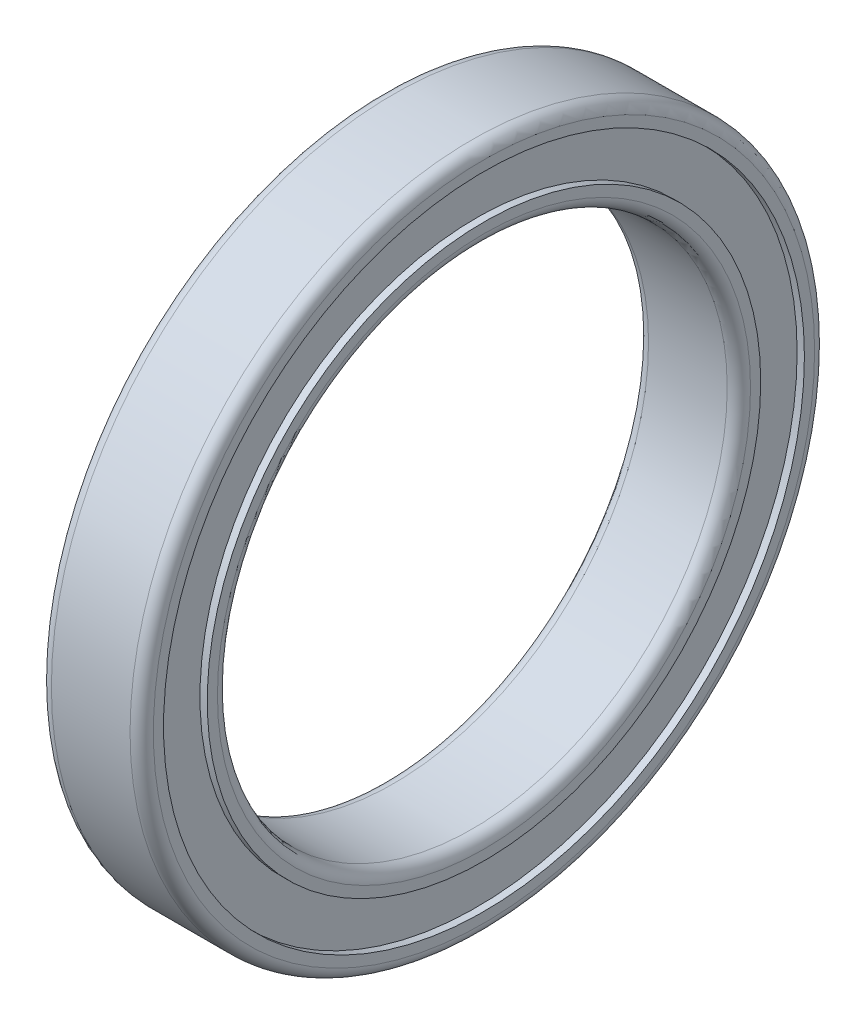
ISO-10303-21;
HEADER;
FILE_DESCRIPTION(('STEP AP214'),'2;1');
FILE_NAME('part.step','',(''),(''),'','','');
FILE_SCHEMA(('AUTOMOTIVE_DESIGN { 1 0 10303 214 1 1 1 1 }'));
ENDSEC;
DATA;
#1=APPLICATION_CONTEXT('core data for automotive mechanical design processes');
#2=APPLICATION_PROTOCOL_DEFINITION('international standard','automotive_design',2000,#1);
#3=PRODUCT_CONTEXT('',#1,'mechanical');
#4=PRODUCT('Part','Part','',(#3));
#5=PRODUCT_RELATED_PRODUCT_CATEGORY('part','',(#4));
#6=PRODUCT_DEFINITION_FORMATION('','',#4);
#7=PRODUCT_DEFINITION_CONTEXT('part definition',#1,'design');
#8=PRODUCT_DEFINITION('design','',#6,#7);
#9=PRODUCT_DEFINITION_SHAPE('','',#8);
#10=(LENGTH_UNIT() NAMED_UNIT(*) SI_UNIT(.MILLI.,.METRE.));
#11=(NAMED_UNIT(*) PLANE_ANGLE_UNIT() SI_UNIT($,.RADIAN.));
#12=(NAMED_UNIT(*) SI_UNIT($,.STERADIAN.) SOLID_ANGLE_UNIT());
#13=UNCERTAINTY_MEASURE_WITH_UNIT(LENGTH_MEASURE(1.E-05),#10,'distance_accuracy_value','');
#14=(GEOMETRIC_REPRESENTATION_CONTEXT(3) GLOBAL_UNCERTAINTY_ASSIGNED_CONTEXT((#13)) GLOBAL_UNIT_ASSIGNED_CONTEXT((#10,
#11,#12)) REPRESENTATION_CONTEXT('',''));
#15=CARTESIAN_POINT('',(0.,0.,0.));
#16=DIRECTION('',(0.,0.,1.));
#17=DIRECTION('',(1.,0.,0.));
#18=AXIS2_PLACEMENT_3D('',#15,#16,#17);
#19=CARTESIAN_POINT('',(-3.5,17.5,0.));
#20=DIRECTION('',(-1.,0.,0.));
#21=DIRECTION('',(0.,0.,1.));
#22=AXIS2_PLACEMENT_3D('',#19,#20,#21);
#23=PLANE('',#22);
#24=CARTESIAN_POINT('',(-3.5,0.,0.));
#25=DIRECTION('',(-1.,0.,0.));
#26=DIRECTION('',(0.,0.,1.));
#27=AXIS2_PLACEMENT_3D('',#24,#25,#26);
#28=CIRCLE('',#27,18.3);
#29=CARTESIAN_POINT('',(-3.5,0.,18.3));
#30=VERTEX_POINT('',#29);
#31=EDGE_CURVE('E49',#30,#30,#28,.F.);
#32=ORIENTED_EDGE('',*,*,#31,.T.);
#33=EDGE_LOOP('',(#32));
#34=FACE_BOUND('',#33,.T.);
#35=CARTESIAN_POINT('',(-3.5,0.,0.));
#36=DIRECTION('',(1.,0.,0.));
#37=DIRECTION('',(0.,0.,-1.));
#38=AXIS2_PLACEMENT_3D('',#35,#36,#37);
#39=CIRCLE('',#38,19.);
#40=CARTESIAN_POINT('',(-3.5,0.,-19.));
#41=VERTEX_POINT('',#40);
#42=EDGE_CURVE('E87',#41,#41,#39,.T.);
#43=ORIENTED_EDGE('',*,*,#42,.F.);
#44=EDGE_LOOP('',(#43));
#45=FACE_BOUND('',#44,.T.);
#46=ADVANCED_FACE('F34',(#34,#45),#23,.T.);
#47=CARTESIAN_POINT('',(0.,0.,0.));
#48=DIRECTION('',(1.,0.,0.));
#49=DIRECTION('',(0.,0.,-1.));
#50=AXIS2_PLACEMENT_3D('',#47,#48,#49);
#51=CYLINDRICAL_SURFACE('',#50,17.5);
#52=CARTESIAN_POINT('',(-2.7,0.,0.));
#53=DIRECTION('',(-1.,0.,0.));
#54=DIRECTION('',(0.,0.,1.));
#55=AXIS2_PLACEMENT_3D('',#52,#53,#54);
#56=CIRCLE('',#55,17.5);
#57=CARTESIAN_POINT('',(-2.7,0.,17.5));
#58=VERTEX_POINT('',#57);
#59=EDGE_CURVE('E41',#58,#58,#56,.T.);
#60=ORIENTED_EDGE('',*,*,#59,.T.);
#61=EDGE_LOOP('',(#60));
#62=FACE_BOUND('',#61,.T.);
#63=CARTESIAN_POINT('',(2.7,0.,0.));
#64=DIRECTION('',(1.,0.,0.));
#65=DIRECTION('',(0.,0.,-1.));
#66=AXIS2_PLACEMENT_3D('',#63,#64,#65);
#67=CIRCLE('',#66,17.5);
#68=CARTESIAN_POINT('',(2.7,0.,-17.5));
#69=VERTEX_POINT('',#68);
#70=EDGE_CURVE('E45',#69,#69,#67,.T.);
#71=ORIENTED_EDGE('',*,*,#70,.T.);
#72=EDGE_LOOP('',(#71));
#73=FACE_BOUND('',#72,.T.);
#74=ADVANCED_FACE('F95',(#62,#73),#51,.F.);
#75=CARTESIAN_POINT('',(3.5,17.5,0.));
#76=DIRECTION('',(1.,0.,0.));
#77=DIRECTION('',(0.,0.,-1.));
#78=AXIS2_PLACEMENT_3D('',#75,#76,#77);
#79=PLANE('',#78);
#80=CARTESIAN_POINT('',(3.5,0.,0.));
#81=DIRECTION('',(1.,0.,0.));
#82=DIRECTION('',(0.,0.,-1.));
#83=AXIS2_PLACEMENT_3D('',#80,#81,#82);
#84=CIRCLE('',#83,18.3);
#85=CARTESIAN_POINT('',(3.5,0.,-18.3));
#86=VERTEX_POINT('',#85);
#87=EDGE_CURVE('E10',#86,#86,#84,.F.);
#88=ORIENTED_EDGE('',*,*,#87,.T.);
#89=EDGE_LOOP('',(#88));
#90=FACE_BOUND('',#89,.T.);
#91=CARTESIAN_POINT('',(3.5,0.,0.));
#92=DIRECTION('',(1.,0.,0.));
#93=DIRECTION('',(0.,0.,-1.));
#94=AXIS2_PLACEMENT_3D('',#91,#92,#93);
#95=CIRCLE('',#94,19.);
#96=CARTESIAN_POINT('',(3.5,0.,-19.));
#97=VERTEX_POINT('',#96);
#98=EDGE_CURVE('E66',#97,#97,#95,.T.);
#99=ORIENTED_EDGE('',*,*,#98,.T.);
#100=EDGE_LOOP('',(#99));
#101=FACE_BOUND('',#100,.T.);
#102=ADVANCED_FACE('F101',(#90,#101),#79,.T.);
#103=CARTESIAN_POINT('',(0.,0.,0.));
#104=DIRECTION('',(1.,0.,0.));
#105=DIRECTION('',(0.,0.,-1.));
#106=AXIS2_PLACEMENT_3D('',#103,#104,#105);
#107=CYLINDRICAL_SURFACE('',#106,19.);
#108=CARTESIAN_POINT('',(3.,0.,0.));
#109=DIRECTION('',(1.,0.,0.));
#110=DIRECTION('',(0.,0.,-1.));
#111=AXIS2_PLACEMENT_3D('',#108,#109,#110);
#112=CIRCLE('',#111,19.);
#113=CARTESIAN_POINT('',(3.,0.,-19.));
#114=VERTEX_POINT('',#113);
#115=EDGE_CURVE('E69',#114,#114,#112,.T.);
#116=ORIENTED_EDGE('',*,*,#115,.T.);
#117=EDGE_LOOP('',(#116));
#118=FACE_BOUND('',#117,.T.);
#119=ORIENTED_EDGE('',*,*,#98,.F.);
#120=EDGE_LOOP('',(#119));
#121=FACE_BOUND('',#120,.T.);
#122=ADVANCED_FACE('F189',(#118,#121),#107,.T.);
#123=CARTESIAN_POINT('',(3.,19.,0.));
#124=DIRECTION('',(1.,0.,0.));
#125=DIRECTION('',(0.,0.,-1.));
#126=AXIS2_PLACEMENT_3D('',#123,#124,#125);
#127=PLANE('',#126);
#128=CARTESIAN_POINT('',(3.,0.,0.));
#129=DIRECTION('',(1.,0.,0.));
#130=DIRECTION('',(0.,0.,-1.));
#131=AXIS2_PLACEMENT_3D('',#128,#129,#130);
#132=CIRCLE('',#131,22.);
#133=CARTESIAN_POINT('',(3.,0.,-22.));
#134=VERTEX_POINT('',#133);
#135=EDGE_CURVE('E72',#134,#134,#132,.T.);
#136=ORIENTED_EDGE('',*,*,#135,.T.);
#137=EDGE_LOOP('',(#136));
#138=FACE_BOUND('',#137,.T.);
#139=ORIENTED_EDGE('',*,*,#115,.F.);
#140=EDGE_LOOP('',(#139));
#141=FACE_BOUND('',#140,.T.);
#142=ADVANCED_FACE('F232',(#138,#141),#127,.T.);
#143=CARTESIAN_POINT('',(0.,0.,0.));
#144=DIRECTION('',(1.,0.,0.));
#145=DIRECTION('',(0.,0.,-1.));
#146=AXIS2_PLACEMENT_3D('',#143,#144,#145);
#147=CYLINDRICAL_SURFACE('',#146,22.);
#148=CARTESIAN_POINT('',(3.5,0.,0.));
#149=DIRECTION('',(1.,0.,0.));
#150=DIRECTION('',(0.,0.,-1.));
#151=AXIS2_PLACEMENT_3D('',#148,#149,#150);
#152=CIRCLE('',#151,22.);
#153=CARTESIAN_POINT('',(3.5,0.,-22.));
#154=VERTEX_POINT('',#153);
#155=EDGE_CURVE('E75',#154,#154,#152,.T.);
#156=ORIENTED_EDGE('',*,*,#155,.T.);
#157=EDGE_LOOP('',(#156));
#158=FACE_BOUND('',#157,.T.);
#159=ORIENTED_EDGE('',*,*,#135,.F.);
#160=EDGE_LOOP('',(#159));
#161=FACE_BOUND('',#160,.T.);
#162=ADVANCED_FACE('F177',(#158,#161),#147,.F.);
#163=CARTESIAN_POINT('',(3.5,22.,0.));
#164=DIRECTION('',(1.,0.,0.));
#165=DIRECTION('',(0.,0.,-1.));
#166=AXIS2_PLACEMENT_3D('',#163,#164,#165);
#167=PLANE('',#166);
#168=CARTESIAN_POINT('',(3.5,0.,0.));
#169=DIRECTION('',(1.,0.,0.));
#170=DIRECTION('',(0.,0.,-1.));
#171=AXIS2_PLACEMENT_3D('',#168,#169,#170);
#172=CIRCLE('',#171,22.7);
#173=CARTESIAN_POINT('',(3.5,0.,-22.7));
#174=VERTEX_POINT('',#173);
#175=EDGE_CURVE('E63',#174,#174,#172,.T.);
#176=ORIENTED_EDGE('',*,*,#175,.T.);
#177=EDGE_LOOP('',(#176));
#178=FACE_BOUND('',#177,.T.);
#179=ORIENTED_EDGE('',*,*,#155,.F.);
#180=EDGE_LOOP('',(#179));
#181=FACE_BOUND('',#180,.T.);
#182=ADVANCED_FACE('F167',(#178,#181),#167,.T.);
#183=CARTESIAN_POINT('',(0.,0.,0.));
#184=DIRECTION('',(1.,0.,0.));
#185=DIRECTION('',(0.,0.,-1.));
#186=AXIS2_PLACEMENT_3D('',#183,#184,#185);
#187=CYLINDRICAL_SURFACE('',#186,23.5);
#188=CARTESIAN_POINT('',(2.7,0.,0.));
#189=DIRECTION('',(1.,0.,0.));
#190=DIRECTION('',(0.,0.,-1.));
#191=AXIS2_PLACEMENT_3D('',#188,#189,#190);
#192=CIRCLE('',#191,23.5);
#193=CARTESIAN_POINT('',(2.7,0.,-23.5));
#194=VERTEX_POINT('',#193);
#195=EDGE_CURVE('E57',#194,#194,#192,.F.);
#196=ORIENTED_EDGE('',*,*,#195,.T.);
#197=EDGE_LOOP('',(#196));
#198=FACE_BOUND('',#197,.T.);
#199=CARTESIAN_POINT('',(-2.7,0.,0.));
#200=DIRECTION('',(-1.,0.,0.));
#201=DIRECTION('',(0.,0.,1.));
#202=AXIS2_PLACEMENT_3D('',#199,#200,#201);
#203=CIRCLE('',#202,23.5);
#204=CARTESIAN_POINT('',(-2.7,0.,23.5));
#205=VERTEX_POINT('',#204);
#206=EDGE_CURVE('E60',#205,#205,#203,.F.);
#207=ORIENTED_EDGE('',*,*,#206,.T.);
#208=EDGE_LOOP('',(#207));
#209=FACE_BOUND('',#208,.T.);
#210=ADVANCED_FACE('F155',(#198,#209),#187,.T.);
#211=CARTESIAN_POINT('',(-3.5,22.,0.));
#212=DIRECTION('',(-1.,0.,0.));
#213=DIRECTION('',(0.,0.,1.));
#214=AXIS2_PLACEMENT_3D('',#211,#212,#213);
#215=PLANE('',#214);
#216=CARTESIAN_POINT('',(-3.5,0.,0.));
#217=DIRECTION('',(-1.,0.,0.));
#218=DIRECTION('',(0.,0.,1.));
#219=AXIS2_PLACEMENT_3D('',#216,#217,#218);
#220=CIRCLE('',#219,22.7);
#221=CARTESIAN_POINT('',(-3.5,0.,22.7));
#222=VERTEX_POINT('',#221);
#223=EDGE_CURVE('E54',#222,#222,#220,.T.);
#224=ORIENTED_EDGE('',*,*,#223,.T.);
#225=EDGE_LOOP('',(#224));
#226=FACE_BOUND('',#225,.T.);
#227=CARTESIAN_POINT('',(-3.5,0.,0.));
#228=DIRECTION('',(1.,0.,0.));
#229=DIRECTION('',(0.,0.,-1.));
#230=AXIS2_PLACEMENT_3D('',#227,#228,#229);
#231=CIRCLE('',#230,22.);
#232=CARTESIAN_POINT('',(-3.5,0.,-22.));
#233=VERTEX_POINT('',#232);
#234=EDGE_CURVE('E78',#233,#233,#231,.T.);
#235=ORIENTED_EDGE('',*,*,#234,.T.);
#236=EDGE_LOOP('',(#235));
#237=FACE_BOUND('',#236,.T.);
#238=ADVANCED_FACE('F149',(#226,#237),#215,.T.);
#239=CARTESIAN_POINT('',(0.,0.,0.));
#240=DIRECTION('',(1.,0.,0.));
#241=DIRECTION('',(0.,0.,-1.));
#242=AXIS2_PLACEMENT_3D('',#239,#240,#241);
#243=CYLINDRICAL_SURFACE('',#242,22.);
#244=CARTESIAN_POINT('',(-3.,0.,0.));
#245=DIRECTION('',(1.,0.,0.));
#246=DIRECTION('',(0.,0.,-1.));
#247=AXIS2_PLACEMENT_3D('',#244,#245,#246);
#248=CIRCLE('',#247,22.);
#249=CARTESIAN_POINT('',(-3.,0.,-22.));
#250=VERTEX_POINT('',#249);
#251=EDGE_CURVE('E81',#250,#250,#248,.T.);
#252=ORIENTED_EDGE('',*,*,#251,.T.);
#253=EDGE_LOOP('',(#252));
#254=FACE_BOUND('',#253,.T.);
#255=ORIENTED_EDGE('',*,*,#234,.F.);
#256=EDGE_LOOP('',(#255));
#257=FACE_BOUND('',#256,.T.);
#258=ADVANCED_FACE('F154',(#254,#257),#243,.F.);
#259=CARTESIAN_POINT('',(-3.,19.,0.));
#260=DIRECTION('',(-1.,0.,0.));
#261=DIRECTION('',(0.,0.,1.));
#262=AXIS2_PLACEMENT_3D('',#259,#260,#261);
#263=PLANE('',#262);
#264=CARTESIAN_POINT('',(-3.,0.,0.));
#265=DIRECTION('',(1.,0.,0.));
#266=DIRECTION('',(0.,0.,-1.));
#267=AXIS2_PLACEMENT_3D('',#264,#265,#266);
#268=CIRCLE('',#267,19.);
#269=CARTESIAN_POINT('',(-3.,0.,-19.));
#270=VERTEX_POINT('',#269);
#271=EDGE_CURVE('E84',#270,#270,#268,.T.);
#272=ORIENTED_EDGE('',*,*,#271,.T.);
#273=EDGE_LOOP('',(#272));
#274=FACE_BOUND('',#273,.T.);
#275=ORIENTED_EDGE('',*,*,#251,.F.);
#276=EDGE_LOOP('',(#275));
#277=FACE_BOUND('',#276,.T.);
#278=ADVANCED_FACE('F207',(#274,#277),#263,.T.);
#279=CARTESIAN_POINT('',(0.,0.,0.));
#280=DIRECTION('',(1.,0.,0.));
#281=DIRECTION('',(0.,0.,-1.));
#282=AXIS2_PLACEMENT_3D('',#279,#280,#281);
#283=CYLINDRICAL_SURFACE('',#282,19.);
#284=ORIENTED_EDGE('',*,*,#42,.T.);
#285=EDGE_LOOP('',(#284));
#286=FACE_BOUND('',#285,.T.);
#287=ORIENTED_EDGE('',*,*,#271,.F.);
#288=EDGE_LOOP('',(#287));
#289=FACE_BOUND('',#288,.T.);
#290=ADVANCED_FACE('F91',(#286,#289),#283,.T.);
#291=CARTESIAN_POINT('',(2.7,0.,0.));
#292=DIRECTION('',(1.,0.,0.));
#293=DIRECTION('',(0.,0.,-1.));
#294=AXIS2_PLACEMENT_3D('',#291,#292,#293);
#295=TOROIDAL_SURFACE('',#294,22.7,0.8);
#296=ORIENTED_EDGE('',*,*,#195,.F.);
#297=EDGE_LOOP('',(#296));
#298=FACE_BOUND('',#297,.T.);
#299=ORIENTED_EDGE('',*,*,#175,.F.);
#300=EDGE_LOOP('',(#299));
#301=FACE_BOUND('',#300,.T.);
#302=ADVANCED_FACE('F105',(#298,#301),#295,.T.);
#303=CARTESIAN_POINT('',(-2.7,0.,0.));
#304=DIRECTION('',(-1.,0.,0.));
#305=DIRECTION('',(0.,0.,1.));
#306=AXIS2_PLACEMENT_3D('',#303,#304,#305);
#307=TOROIDAL_SURFACE('',#306,22.7,0.8);
#308=ORIENTED_EDGE('',*,*,#223,.F.);
#309=EDGE_LOOP('',(#308));
#310=FACE_BOUND('',#309,.T.);
#311=ORIENTED_EDGE('',*,*,#206,.F.);
#312=EDGE_LOOP('',(#311));
#313=FACE_BOUND('',#312,.T.);
#314=ADVANCED_FACE('F108',(#310,#313),#307,.T.);
#315=CARTESIAN_POINT('',(-2.7,0.,0.));
#316=DIRECTION('',(-1.,0.,0.));
#317=DIRECTION('',(0.,0.,1.));
#318=AXIS2_PLACEMENT_3D('',#315,#316,#317);
#319=TOROIDAL_SURFACE('',#318,18.3,0.8);
#320=ORIENTED_EDGE('',*,*,#59,.F.);
#321=EDGE_LOOP('',(#320));
#322=FACE_BOUND('',#321,.T.);
#323=ORIENTED_EDGE('',*,*,#31,.F.);
#324=EDGE_LOOP('',(#323));
#325=FACE_BOUND('',#324,.T.);
#326=ADVANCED_FACE('F111',(#322,#325),#319,.T.);
#327=CARTESIAN_POINT('',(2.7,0.,0.));
#328=DIRECTION('',(1.,0.,0.));
#329=DIRECTION('',(0.,0.,-1.));
#330=AXIS2_PLACEMENT_3D('',#327,#328,#329);
#331=TOROIDAL_SURFACE('',#330,18.3,0.8);
#332=ORIENTED_EDGE('',*,*,#87,.F.);
#333=EDGE_LOOP('',(#332));
#334=FACE_BOUND('',#333,.T.);
#335=ORIENTED_EDGE('',*,*,#70,.F.);
#336=EDGE_LOOP('',(#335));
#337=FACE_BOUND('',#336,.T.);
#338=ADVANCED_FACE('F36',(#334,#337),#331,.T.);
#339=CLOSED_SHELL('',(#46,#74,#102,#122,#142,#162,#182,#210,#238,#258,#278,#290,#302,#314,#326,#338));
#340=MANIFOLD_SOLID_BREP('B2',#339);
#341=ADVANCED_BREP_SHAPE_REPRESENTATION('',(#18,#340),#14);
#342=SHAPE_DEFINITION_REPRESENTATION(#9,#341);
ENDSEC;
END-ISO-10303-21;
